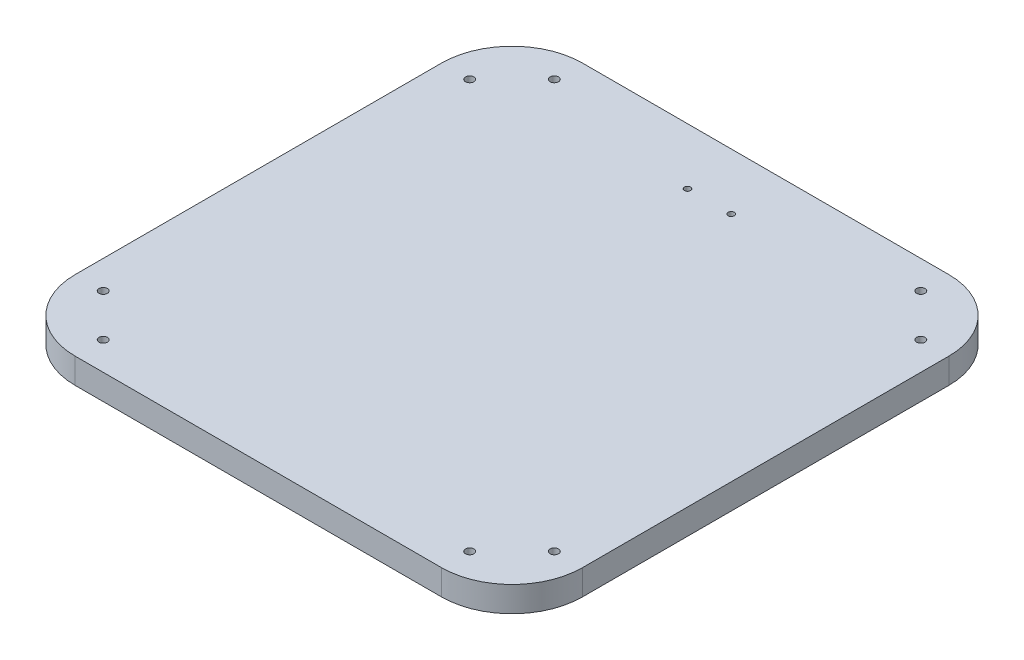
ISO-10303-21;
HEADER;
FILE_DESCRIPTION(('STEP AP214'),'2;1');
FILE_NAME('part.step','',(''),(''),'','','');
FILE_SCHEMA(('AUTOMOTIVE_DESIGN { 1 0 10303 214 1 1 1 1 }'));
ENDSEC;
DATA;
#1=APPLICATION_CONTEXT('core data for automotive mechanical design processes');
#2=APPLICATION_PROTOCOL_DEFINITION('international standard','automotive_design',2000,#1);
#3=PRODUCT_CONTEXT('',#1,'mechanical');
#4=PRODUCT('Part','Part','',(#3));
#5=PRODUCT_RELATED_PRODUCT_CATEGORY('part','',(#4));
#6=PRODUCT_DEFINITION_FORMATION('','',#4);
#7=PRODUCT_DEFINITION_CONTEXT('part definition',#1,'design');
#8=PRODUCT_DEFINITION('design','',#6,#7);
#9=PRODUCT_DEFINITION_SHAPE('','',#8);
#10=(LENGTH_UNIT() NAMED_UNIT(*) SI_UNIT(.MILLI.,.METRE.));
#11=(NAMED_UNIT(*) PLANE_ANGLE_UNIT() SI_UNIT($,.RADIAN.));
#12=(NAMED_UNIT(*) SI_UNIT($,.STERADIAN.) SOLID_ANGLE_UNIT());
#13=UNCERTAINTY_MEASURE_WITH_UNIT(LENGTH_MEASURE(1.E-05),#10,'distance_accuracy_value','');
#14=(GEOMETRIC_REPRESENTATION_CONTEXT(3) GLOBAL_UNCERTAINTY_ASSIGNED_CONTEXT((#13)) GLOBAL_UNIT_ASSIGNED_CONTEXT((#10,
#11,#12)) REPRESENTATION_CONTEXT('',''));
#15=CARTESIAN_POINT('',(0.,0.,0.));
#16=DIRECTION('',(0.,0.,1.));
#17=DIRECTION('',(1.,0.,0.));
#18=AXIS2_PLACEMENT_3D('',#15,#16,#17);
#19=CARTESIAN_POINT('',(64.9999999999998,9.,-64.9999999999999));
#20=DIRECTION('',(0.,-1.,0.));
#21=DIRECTION('',(0.,0.,-1.));
#22=AXIS2_PLACEMENT_3D('',#19,#20,#21);
#23=CYLINDRICAL_SURFACE('',#22,25.0000000000002);
#24=CARTESIAN_POINT('',(64.9999999999998,0.,-64.9999999999999));
#25=DIRECTION('',(0.,1.,0.));
#26=DIRECTION('',(0.,0.,-1.));
#27=AXIS2_PLACEMENT_3D('',#24,#25,#26);
#28=CIRCLE('',#27,25.0000000000002);
#29=CARTESIAN_POINT('',(90.,0.,-64.9999999999999));
#30=VERTEX_POINT('',#29);
#31=CARTESIAN_POINT('',(64.9999999999998,0.,-90.0000000000001));
#32=VERTEX_POINT('',#31);
#33=EDGE_CURVE('E135',#30,#32,#28,.T.);
#34=ORIENTED_EDGE('',*,*,#33,.T.);
#35=DIRECTION('',(0.,-1.,0.));
#36=VECTOR('',#35,1.);
#37=CARTESIAN_POINT('',(64.9999999999998,9.,-90.0000000000001));
#38=LINE('',#37,#36);
#39=CARTESIAN_POINT('',(64.9999999999998,9.,-90.0000000000001));
#40=VERTEX_POINT('',#39);
#41=EDGE_CURVE('E11',#40,#32,#38,.T.);
#42=ORIENTED_EDGE('',*,*,#41,.F.);
#43=CARTESIAN_POINT('',(64.9999999999998,9.,-64.9999999999999));
#44=DIRECTION('',(0.,1.,0.));
#45=DIRECTION('',(0.,0.,-1.));
#46=AXIS2_PLACEMENT_3D('',#43,#44,#45);
#47=CIRCLE('',#46,25.0000000000002);
#48=CARTESIAN_POINT('',(90.,9.,-64.9999999999999));
#49=VERTEX_POINT('',#48);
#50=EDGE_CURVE('E150',#49,#40,#47,.T.);
#51=ORIENTED_EDGE('',*,*,#50,.F.);
#52=DIRECTION('',(0.,-1.,0.));
#53=VECTOR('',#52,1.);
#54=CARTESIAN_POINT('',(90.,9.,-64.9999999999999));
#55=LINE('',#54,#53);
#56=EDGE_CURVE('E131',#49,#30,#55,.T.);
#57=ORIENTED_EDGE('',*,*,#56,.T.);
#58=EDGE_LOOP('',(#34,#42,#51,#57));
#59=FACE_BOUND('',#58,.T.);
#60=ADVANCED_FACE('F39',(#59),#23,.T.);
#61=CARTESIAN_POINT('',(-64.9999999999998,9.,-90.0000000000001));
#62=DIRECTION('',(0.,0.,1.));
#63=DIRECTION('',(1.,0.,0.));
#64=AXIS2_PLACEMENT_3D('',#61,#62,#63);
#65=PLANE('',#64);
#66=DIRECTION('',(-1.,0.,0.));
#67=VECTOR('',#66,1.);
#68=CARTESIAN_POINT('',(-64.9999999999998,0.,-90.0000000000001));
#69=LINE('',#68,#67);
#70=CARTESIAN_POINT('',(-64.9999999999998,0.,-90.0000000000001));
#71=VERTEX_POINT('',#70);
#72=EDGE_CURVE('E138',#32,#71,#69,.T.);
#73=ORIENTED_EDGE('',*,*,#72,.T.);
#74=DIRECTION('',(0.,-1.,0.));
#75=VECTOR('',#74,1.);
#76=CARTESIAN_POINT('',(-64.9999999999998,9.,-90.0000000000001));
#77=LINE('',#76,#75);
#78=CARTESIAN_POINT('',(-64.9999999999998,9.,-90.0000000000001));
#79=VERTEX_POINT('',#78);
#80=EDGE_CURVE('E47',#79,#71,#77,.T.);
#81=ORIENTED_EDGE('',*,*,#80,.F.);
#82=DIRECTION('',(-1.,0.,0.));
#83=VECTOR('',#82,1.);
#84=CARTESIAN_POINT('',(-64.9999999999998,9.,-90.0000000000001));
#85=LINE('',#84,#83);
#86=EDGE_CURVE('E98',#40,#79,#85,.T.);
#87=ORIENTED_EDGE('',*,*,#86,.F.);
#88=ORIENTED_EDGE('',*,*,#41,.T.);
#89=EDGE_LOOP('',(#73,#81,#87,#88));
#90=FACE_BOUND('',#89,.T.);
#91=ADVANCED_FACE('F277',(#90),#65,.F.);
#92=CARTESIAN_POINT('',(-64.9999999999998,9.,-64.9999999999999));
#93=DIRECTION('',(0.,-1.,0.));
#94=DIRECTION('',(0.,0.,-1.));
#95=AXIS2_PLACEMENT_3D('',#92,#93,#94);
#96=CYLINDRICAL_SURFACE('',#95,25.0000000000002);
#97=CARTESIAN_POINT('',(-64.9999999999998,0.,-64.9999999999999));
#98=DIRECTION('',(0.,1.,0.));
#99=DIRECTION('',(0.,0.,-1.));
#100=AXIS2_PLACEMENT_3D('',#97,#98,#99);
#101=CIRCLE('',#100,25.0000000000002);
#102=CARTESIAN_POINT('',(-90.,0.,-64.9999999999999));
#103=VERTEX_POINT('',#102);
#104=EDGE_CURVE('E141',#71,#103,#101,.T.);
#105=ORIENTED_EDGE('',*,*,#104,.T.);
#106=DIRECTION('',(0.,-1.,0.));
#107=VECTOR('',#106,1.);
#108=CARTESIAN_POINT('',(-90.,9.,-64.9999999999999));
#109=LINE('',#108,#107);
#110=CARTESIAN_POINT('',(-90.,9.,-64.9999999999999));
#111=VERTEX_POINT('',#110);
#112=EDGE_CURVE('E157',#111,#103,#109,.T.);
#113=ORIENTED_EDGE('',*,*,#112,.F.);
#114=CARTESIAN_POINT('',(-64.9999999999998,9.,-64.9999999999999));
#115=DIRECTION('',(0.,1.,0.));
#116=DIRECTION('',(0.,0.,-1.));
#117=AXIS2_PLACEMENT_3D('',#114,#115,#116);
#118=CIRCLE('',#117,25.0000000000002);
#119=EDGE_CURVE('E165',#79,#111,#118,.T.);
#120=ORIENTED_EDGE('',*,*,#119,.F.);
#121=ORIENTED_EDGE('',*,*,#80,.T.);
#122=EDGE_LOOP('',(#105,#113,#120,#121));
#123=FACE_BOUND('',#122,.T.);
#124=ADVANCED_FACE('F163',(#123),#96,.T.);
#125=CARTESIAN_POINT('',(-90.,9.,65.));
#126=DIRECTION('',(1.,0.,0.));
#127=DIRECTION('',(0.,0.,-1.));
#128=AXIS2_PLACEMENT_3D('',#125,#126,#127);
#129=PLANE('',#128);
#130=DIRECTION('',(0.,0.,1.));
#131=VECTOR('',#130,1.);
#132=CARTESIAN_POINT('',(-90.,0.,65.));
#133=LINE('',#132,#131);
#134=CARTESIAN_POINT('',(-90.,0.,65.));
#135=VERTEX_POINT('',#134);
#136=EDGE_CURVE('E143',#103,#135,#133,.T.);
#137=ORIENTED_EDGE('',*,*,#136,.T.);
#138=DIRECTION('',(0.,-1.,0.));
#139=VECTOR('',#138,1.);
#140=CARTESIAN_POINT('',(-90.,9.,65.));
#141=LINE('',#140,#139);
#142=CARTESIAN_POINT('',(-90.,9.,65.));
#143=VERTEX_POINT('',#142);
#144=EDGE_CURVE('E154',#143,#135,#141,.T.);
#145=ORIENTED_EDGE('',*,*,#144,.F.);
#146=DIRECTION('',(0.,0.,1.));
#147=VECTOR('',#146,1.);
#148=CARTESIAN_POINT('',(-90.,9.,65.));
#149=LINE('',#148,#147);
#150=EDGE_CURVE('E177',#111,#143,#149,.T.);
#151=ORIENTED_EDGE('',*,*,#150,.F.);
#152=ORIENTED_EDGE('',*,*,#112,.T.);
#153=EDGE_LOOP('',(#137,#145,#151,#152));
#154=FACE_BOUND('',#153,.T.);
#155=ADVANCED_FACE('F173',(#154),#129,.F.);
#156=CARTESIAN_POINT('',(-65.,9.,65.));
#157=DIRECTION('',(0.,-1.,0.));
#158=DIRECTION('',(0.,0.,-1.));
#159=AXIS2_PLACEMENT_3D('',#156,#157,#158);
#160=CYLINDRICAL_SURFACE('',#159,25.);
#161=CARTESIAN_POINT('',(-65.,0.,65.));
#162=DIRECTION('',(0.,1.,0.));
#163=DIRECTION('',(0.,0.,-1.));
#164=AXIS2_PLACEMENT_3D('',#161,#162,#163);
#165=CIRCLE('',#164,25.);
#166=CARTESIAN_POINT('',(-64.9999999999998,0.,90.0000000000001));
#167=VERTEX_POINT('',#166);
#168=EDGE_CURVE('E145',#135,#167,#165,.T.);
#169=ORIENTED_EDGE('',*,*,#168,.T.);
#170=DIRECTION('',(0.,-1.,0.));
#171=VECTOR('',#170,1.);
#172=CARTESIAN_POINT('',(-64.9999999999998,9.,90.0000000000001));
#173=LINE('',#172,#171);
#174=CARTESIAN_POINT('',(-64.9999999999998,9.,90.0000000000001));
#175=VERTEX_POINT('',#174);
#176=EDGE_CURVE('E126',#175,#167,#173,.T.);
#177=ORIENTED_EDGE('',*,*,#176,.F.);
#178=CARTESIAN_POINT('',(-65.,9.,65.));
#179=DIRECTION('',(0.,1.,0.));
#180=DIRECTION('',(0.,0.,-1.));
#181=AXIS2_PLACEMENT_3D('',#178,#179,#180);
#182=CIRCLE('',#181,25.);
#183=EDGE_CURVE('E117',#143,#175,#182,.T.);
#184=ORIENTED_EDGE('',*,*,#183,.F.);
#185=ORIENTED_EDGE('',*,*,#144,.T.);
#186=EDGE_LOOP('',(#169,#177,#184,#185));
#187=FACE_BOUND('',#186,.T.);
#188=ADVANCED_FACE('F176',(#187),#160,.T.);
#189=CARTESIAN_POINT('',(-64.9999999999998,9.,90.0000000000001));
#190=DIRECTION('',(0.,0.,-1.));
#191=DIRECTION('',(-1.,0.,0.));
#192=AXIS2_PLACEMENT_3D('',#189,#190,#191);
#193=PLANE('',#192);
#194=DIRECTION('',(1.,0.,0.));
#195=VECTOR('',#194,1.);
#196=CARTESIAN_POINT('',(-64.9999999999998,0.,90.0000000000001));
#197=LINE('',#196,#195);
#198=CARTESIAN_POINT('',(64.9999999999998,0.,90.0000000000001));
#199=VERTEX_POINT('',#198);
#200=EDGE_CURVE('E125',#167,#199,#197,.T.);
#201=ORIENTED_EDGE('',*,*,#200,.T.);
#202=DIRECTION('',(0.,-1.,0.));
#203=VECTOR('',#202,1.);
#204=CARTESIAN_POINT('',(64.9999999999998,9.,90.0000000000001));
#205=LINE('',#204,#203);
#206=CARTESIAN_POINT('',(64.9999999999998,9.,90.0000000000001));
#207=VERTEX_POINT('',#206);
#208=EDGE_CURVE('E122',#207,#199,#205,.T.);
#209=ORIENTED_EDGE('',*,*,#208,.F.);
#210=DIRECTION('',(1.,0.,0.));
#211=VECTOR('',#210,1.);
#212=CARTESIAN_POINT('',(-64.9999999999998,9.,90.0000000000001));
#213=LINE('',#212,#211);
#214=EDGE_CURVE('E111',#175,#207,#213,.T.);
#215=ORIENTED_EDGE('',*,*,#214,.F.);
#216=ORIENTED_EDGE('',*,*,#176,.T.);
#217=EDGE_LOOP('',(#201,#209,#215,#216));
#218=FACE_BOUND('',#217,.T.);
#219=ADVANCED_FACE('F123',(#218),#193,.F.);
#220=CARTESIAN_POINT('',(65.,9.,65.));
#221=DIRECTION('',(0.,-1.,0.));
#222=DIRECTION('',(0.,0.,-1.));
#223=AXIS2_PLACEMENT_3D('',#220,#221,#222);
#224=CYLINDRICAL_SURFACE('',#223,25.);
#225=CARTESIAN_POINT('',(65.,0.,65.));
#226=DIRECTION('',(0.,1.,0.));
#227=DIRECTION('',(0.,0.,-1.));
#228=AXIS2_PLACEMENT_3D('',#225,#226,#227);
#229=CIRCLE('',#228,25.);
#230=CARTESIAN_POINT('',(90.,0.,65.));
#231=VERTEX_POINT('',#230);
#232=EDGE_CURVE('E84',#199,#231,#229,.T.);
#233=ORIENTED_EDGE('',*,*,#232,.T.);
#234=DIRECTION('',(0.,-1.,0.));
#235=VECTOR('',#234,1.);
#236=CARTESIAN_POINT('',(90.,9.,65.));
#237=LINE('',#236,#235);
#238=CARTESIAN_POINT('',(90.,9.,65.));
#239=VERTEX_POINT('',#238);
#240=EDGE_CURVE('E127',#239,#231,#237,.T.);
#241=ORIENTED_EDGE('',*,*,#240,.F.);
#242=CARTESIAN_POINT('',(65.,9.,65.));
#243=DIRECTION('',(0.,1.,0.));
#244=DIRECTION('',(0.,0.,-1.));
#245=AXIS2_PLACEMENT_3D('',#242,#243,#244);
#246=CIRCLE('',#245,25.);
#247=EDGE_CURVE('E115',#207,#239,#246,.T.);
#248=ORIENTED_EDGE('',*,*,#247,.F.);
#249=ORIENTED_EDGE('',*,*,#208,.T.);
#250=EDGE_LOOP('',(#233,#241,#248,#249));
#251=FACE_BOUND('',#250,.T.);
#252=ADVANCED_FACE('F129',(#251),#224,.T.);
#253=CARTESIAN_POINT('',(90.,9.,65.));
#254=DIRECTION('',(-1.,0.,0.));
#255=DIRECTION('',(0.,0.,1.));
#256=AXIS2_PLACEMENT_3D('',#253,#254,#255);
#257=PLANE('',#256);
#258=DIRECTION('',(0.,0.,-1.));
#259=VECTOR('',#258,1.);
#260=CARTESIAN_POINT('',(90.,0.,65.));
#261=LINE('',#260,#259);
#262=EDGE_CURVE('E90',#231,#30,#261,.T.);
#263=ORIENTED_EDGE('',*,*,#262,.T.);
#264=ORIENTED_EDGE('',*,*,#56,.F.);
#265=DIRECTION('',(0.,0.,-1.));
#266=VECTOR('',#265,1.);
#267=CARTESIAN_POINT('',(90.,9.,65.));
#268=LINE('',#267,#266);
#269=EDGE_CURVE('E55',#239,#49,#268,.T.);
#270=ORIENTED_EDGE('',*,*,#269,.F.);
#271=ORIENTED_EDGE('',*,*,#240,.T.);
#272=EDGE_LOOP('',(#263,#264,#270,#271));
#273=FACE_BOUND('',#272,.T.);
#274=ADVANCED_FACE('F247',(#273),#257,.F.);
#275=CARTESIAN_POINT('',(64.9999999999998,9.,-64.9999999999999));
#276=DIRECTION('',(0.,-1.,0.));
#277=DIRECTION('',(0.,0.,-1.));
#278=AXIS2_PLACEMENT_3D('',#275,#276,#277);
#279=PLANE('',#278);
#280=CARTESIAN_POINT('',(64.9999999999998,9.,-79.9999999999999));
#281=DIRECTION('',(0.,1.,0.));
#282=DIRECTION('',(0.,0.,1.));
#283=AXIS2_PLACEMENT_3D('',#280,#281,#282);
#284=CIRCLE('',#283,1.5);
#285=CARTESIAN_POINT('',(64.9999999999998,9.,-78.4999999999999));
#286=VERTEX_POINT('',#285);
#287=EDGE_CURVE('E216',#286,#286,#284,.T.);
#288=ORIENTED_EDGE('',*,*,#287,.F.);
#289=EDGE_LOOP('',(#288));
#290=FACE_BOUND('',#289,.T.);
#291=CARTESIAN_POINT('',(79.9999999999998,9.,65.));
#292=DIRECTION('',(0.,1.,0.));
#293=DIRECTION('',(0.,0.,1.));
#294=AXIS2_PLACEMENT_3D('',#291,#292,#293);
#295=CIRCLE('',#294,1.5);
#296=CARTESIAN_POINT('',(79.9999999999998,9.,66.5));
#297=VERTEX_POINT('',#296);
#298=EDGE_CURVE('E205',#297,#297,#295,.T.);
#299=ORIENTED_EDGE('',*,*,#298,.F.);
#300=EDGE_LOOP('',(#299));
#301=FACE_BOUND('',#300,.T.);
#302=CARTESIAN_POINT('',(79.9999999999998,9.,-64.9999999999999));
#303=DIRECTION('',(0.,1.,0.));
#304=DIRECTION('',(0.,0.,1.));
#305=AXIS2_PLACEMENT_3D('',#302,#303,#304);
#306=CIRCLE('',#305,1.5);
#307=CARTESIAN_POINT('',(79.9999999999998,9.,-63.4999999999999));
#308=VERTEX_POINT('',#307);
#309=EDGE_CURVE('E204',#308,#308,#306,.T.);
#310=ORIENTED_EDGE('',*,*,#309,.F.);
#311=EDGE_LOOP('',(#310));
#312=FACE_BOUND('',#311,.T.);
#313=CARTESIAN_POINT('',(-79.9999999999998,9.,-64.9999999999999));
#314=DIRECTION('',(0.,1.,0.));
#315=DIRECTION('',(0.,0.,1.));
#316=AXIS2_PLACEMENT_3D('',#313,#314,#315);
#317=CIRCLE('',#316,1.5);
#318=CARTESIAN_POINT('',(-79.9999999999998,9.,-63.4999999999999));
#319=VERTEX_POINT('',#318);
#320=EDGE_CURVE('E198',#319,#319,#317,.T.);
#321=ORIENTED_EDGE('',*,*,#320,.F.);
#322=EDGE_LOOP('',(#321));
#323=FACE_BOUND('',#322,.T.);
#324=CARTESIAN_POINT('',(64.9999999999998,9.,80.));
#325=DIRECTION('',(0.,1.,0.));
#326=DIRECTION('',(0.,0.,1.));
#327=AXIS2_PLACEMENT_3D('',#324,#325,#326);
#328=CIRCLE('',#327,1.5);
#329=CARTESIAN_POINT('',(64.9999999999998,9.,81.5));
#330=VERTEX_POINT('',#329);
#331=EDGE_CURVE('E217',#330,#330,#328,.T.);
#332=ORIENTED_EDGE('',*,*,#331,.F.);
#333=EDGE_LOOP('',(#332));
#334=FACE_BOUND('',#333,.T.);
#335=CARTESIAN_POINT('',(-64.9999999999997,9.,80.));
#336=DIRECTION('',(0.,1.,0.));
#337=DIRECTION('',(0.,0.,1.));
#338=AXIS2_PLACEMENT_3D('',#335,#336,#337);
#339=CIRCLE('',#338,1.5);
#340=CARTESIAN_POINT('',(-64.9999999999997,9.,81.5));
#341=VERTEX_POINT('',#340);
#342=EDGE_CURVE('E234',#341,#341,#339,.T.);
#343=ORIENTED_EDGE('',*,*,#342,.F.);
#344=EDGE_LOOP('',(#343));
#345=FACE_BOUND('',#344,.T.);
#346=CARTESIAN_POINT('',(-79.9999999999997,9.,65.));
#347=DIRECTION('',(0.,1.,0.));
#348=DIRECTION('',(0.,0.,1.));
#349=AXIS2_PLACEMENT_3D('',#346,#347,#348);
#350=CIRCLE('',#349,1.5);
#351=CARTESIAN_POINT('',(-79.9999999999997,9.,66.5));
#352=VERTEX_POINT('',#351);
#353=EDGE_CURVE('E228',#352,#352,#350,.T.);
#354=ORIENTED_EDGE('',*,*,#353,.F.);
#355=EDGE_LOOP('',(#354));
#356=FACE_BOUND('',#355,.T.);
#357=CARTESIAN_POINT('',(-64.9999999999998,9.,-79.9999999999999));
#358=DIRECTION('',(0.,1.,0.));
#359=DIRECTION('',(0.,0.,1.));
#360=AXIS2_PLACEMENT_3D('',#357,#358,#359);
#361=CIRCLE('',#360,1.5);
#362=CARTESIAN_POINT('',(-64.9999999999998,9.,-78.4999999999999));
#363=VERTEX_POINT('',#362);
#364=EDGE_CURVE('E195',#363,#363,#361,.T.);
#365=ORIENTED_EDGE('',*,*,#364,.F.);
#366=EDGE_LOOP('',(#365));
#367=FACE_BOUND('',#366,.T.);
#368=CARTESIAN_POINT('',(-7.747,9.,-70.0000000000001));
#369=DIRECTION('',(0.,1.,0.));
#370=DIRECTION('',(0.,0.,1.));
#371=AXIS2_PLACEMENT_3D('',#368,#369,#370);
#372=CIRCLE('',#371,1.09);
#373=CARTESIAN_POINT('',(-7.747,9.,-68.9100000000001));
#374=VERTEX_POINT('',#373);
#375=EDGE_CURVE('E190',#374,#374,#372,.T.);
#376=ORIENTED_EDGE('',*,*,#375,.F.);
#377=EDGE_LOOP('',(#376));
#378=FACE_BOUND('',#377,.T.);
#379=CARTESIAN_POINT('',(7.747,9.,-70.0000000000001));
#380=DIRECTION('',(0.,1.,0.));
#381=DIRECTION('',(0.,0.,1.));
#382=AXIS2_PLACEMENT_3D('',#379,#380,#381);
#383=CIRCLE('',#382,1.09);
#384=CARTESIAN_POINT('',(7.747,9.,-68.9100000000001));
#385=VERTEX_POINT('',#384);
#386=EDGE_CURVE('E186',#385,#385,#383,.T.);
#387=ORIENTED_EDGE('',*,*,#386,.F.);
#388=EDGE_LOOP('',(#387));
#389=FACE_BOUND('',#388,.T.);
#390=ORIENTED_EDGE('',*,*,#50,.T.);
#391=ORIENTED_EDGE('',*,*,#86,.T.);
#392=ORIENTED_EDGE('',*,*,#119,.T.);
#393=ORIENTED_EDGE('',*,*,#150,.T.);
#394=ORIENTED_EDGE('',*,*,#183,.T.);
#395=ORIENTED_EDGE('',*,*,#214,.T.);
#396=ORIENTED_EDGE('',*,*,#247,.T.);
#397=ORIENTED_EDGE('',*,*,#269,.T.);
#398=EDGE_LOOP('',(#390,#391,#392,#393,#394,#395,#396,#397));
#399=FACE_BOUND('',#398,.T.);
#400=ADVANCED_FACE('F113',(#290,#301,#312,#323,#334,#345,#356,#367,#378,#389,#399),#279,.F.);
#401=CARTESIAN_POINT('',(64.9999999999998,0.,-64.9999999999999));
#402=DIRECTION('',(0.,-1.,0.));
#403=DIRECTION('',(0.,0.,-1.));
#404=AXIS2_PLACEMENT_3D('',#401,#402,#403);
#405=PLANE('',#404);
#406=CARTESIAN_POINT('',(64.9999999999998,0.,-79.9999999999999));
#407=DIRECTION('',(0.,1.,0.));
#408=DIRECTION('',(0.,0.,1.));
#409=AXIS2_PLACEMENT_3D('',#406,#407,#408);
#410=CIRCLE('',#409,1.5);
#411=CARTESIAN_POINT('',(64.9999999999998,0.,-78.4999999999999));
#412=VERTEX_POINT('',#411);
#413=EDGE_CURVE('E213',#412,#412,#410,.T.);
#414=ORIENTED_EDGE('',*,*,#413,.T.);
#415=EDGE_LOOP('',(#414));
#416=FACE_BOUND('',#415,.T.);
#417=CARTESIAN_POINT('',(79.9999999999998,0.,65.));
#418=DIRECTION('',(0.,1.,0.));
#419=DIRECTION('',(0.,0.,1.));
#420=AXIS2_PLACEMENT_3D('',#417,#418,#419);
#421=CIRCLE('',#420,1.5);
#422=CARTESIAN_POINT('',(79.9999999999998,0.,66.5));
#423=VERTEX_POINT('',#422);
#424=EDGE_CURVE('E220',#423,#423,#421,.T.);
#425=ORIENTED_EDGE('',*,*,#424,.T.);
#426=EDGE_LOOP('',(#425));
#427=FACE_BOUND('',#426,.T.);
#428=CARTESIAN_POINT('',(79.9999999999998,0.,-64.9999999999999));
#429=DIRECTION('',(0.,1.,0.));
#430=DIRECTION('',(0.,0.,1.));
#431=AXIS2_PLACEMENT_3D('',#428,#429,#430);
#432=CIRCLE('',#431,1.5);
#433=CARTESIAN_POINT('',(79.9999999999998,0.,-63.4999999999999));
#434=VERTEX_POINT('',#433);
#435=EDGE_CURVE('E201',#434,#434,#432,.T.);
#436=ORIENTED_EDGE('',*,*,#435,.T.);
#437=EDGE_LOOP('',(#436));
#438=FACE_BOUND('',#437,.T.);
#439=CARTESIAN_POINT('',(-79.9999999999998,0.,-64.9999999999999));
#440=DIRECTION('',(0.,1.,0.));
#441=DIRECTION('',(0.,0.,1.));
#442=AXIS2_PLACEMENT_3D('',#439,#440,#441);
#443=CIRCLE('',#442,1.5);
#444=CARTESIAN_POINT('',(-79.9999999999998,0.,-63.4999999999999));
#445=VERTEX_POINT('',#444);
#446=EDGE_CURVE('E208',#445,#445,#443,.T.);
#447=ORIENTED_EDGE('',*,*,#446,.T.);
#448=EDGE_LOOP('',(#447));
#449=FACE_BOUND('',#448,.T.);
#450=CARTESIAN_POINT('',(64.9999999999998,0.,80.));
#451=DIRECTION('',(0.,1.,0.));
#452=DIRECTION('',(0.,0.,1.));
#453=AXIS2_PLACEMENT_3D('',#450,#451,#452);
#454=CIRCLE('',#453,1.5);
#455=CARTESIAN_POINT('',(64.9999999999998,0.,81.5));
#456=VERTEX_POINT('',#455);
#457=EDGE_CURVE('E237',#456,#456,#454,.T.);
#458=ORIENTED_EDGE('',*,*,#457,.T.);
#459=EDGE_LOOP('',(#458));
#460=FACE_BOUND('',#459,.T.);
#461=CARTESIAN_POINT('',(-64.9999999999997,0.,80.));
#462=DIRECTION('',(0.,1.,0.));
#463=DIRECTION('',(0.,0.,1.));
#464=AXIS2_PLACEMENT_3D('',#461,#462,#463);
#465=CIRCLE('',#464,1.5);
#466=CARTESIAN_POINT('',(-64.9999999999997,0.,81.5));
#467=VERTEX_POINT('',#466);
#468=EDGE_CURVE('E231',#467,#467,#465,.T.);
#469=ORIENTED_EDGE('',*,*,#468,.T.);
#470=EDGE_LOOP('',(#469));
#471=FACE_BOUND('',#470,.T.);
#472=CARTESIAN_POINT('',(-79.9999999999997,0.,65.));
#473=DIRECTION('',(0.,1.,0.));
#474=DIRECTION('',(0.,0.,1.));
#475=AXIS2_PLACEMENT_3D('',#472,#473,#474);
#476=CIRCLE('',#475,1.5);
#477=CARTESIAN_POINT('',(-79.9999999999997,0.,66.5));
#478=VERTEX_POINT('',#477);
#479=EDGE_CURVE('E225',#478,#478,#476,.T.);
#480=ORIENTED_EDGE('',*,*,#479,.T.);
#481=EDGE_LOOP('',(#480));
#482=FACE_BOUND('',#481,.T.);
#483=CARTESIAN_POINT('',(-64.9999999999998,0.,-79.9999999999999));
#484=DIRECTION('',(0.,1.,0.));
#485=DIRECTION('',(0.,0.,1.));
#486=AXIS2_PLACEMENT_3D('',#483,#484,#485);
#487=CIRCLE('',#486,1.5);
#488=CARTESIAN_POINT('',(-64.9999999999998,0.,-78.4999999999999));
#489=VERTEX_POINT('',#488);
#490=EDGE_CURVE('E187',#489,#489,#487,.T.);
#491=ORIENTED_EDGE('',*,*,#490,.T.);
#492=EDGE_LOOP('',(#491));
#493=FACE_BOUND('',#492,.T.);
#494=CARTESIAN_POINT('',(-7.747,0.,-70.0000000000001));
#495=DIRECTION('',(0.,1.,0.));
#496=DIRECTION('',(0.,0.,1.));
#497=AXIS2_PLACEMENT_3D('',#494,#495,#496);
#498=CIRCLE('',#497,1.09);
#499=CARTESIAN_POINT('',(-7.747,0.,-68.9100000000001));
#500=VERTEX_POINT('',#499);
#501=EDGE_CURVE('E139',#500,#500,#498,.T.);
#502=ORIENTED_EDGE('',*,*,#501,.T.);
#503=EDGE_LOOP('',(#502));
#504=FACE_BOUND('',#503,.T.);
#505=CARTESIAN_POINT('',(7.747,0.,-70.0000000000001));
#506=DIRECTION('',(0.,1.,0.));
#507=DIRECTION('',(0.,0.,1.));
#508=AXIS2_PLACEMENT_3D('',#505,#506,#507);
#509=CIRCLE('',#508,1.09);
#510=CARTESIAN_POINT('',(7.747,0.,-68.9100000000001));
#511=VERTEX_POINT('',#510);
#512=EDGE_CURVE('E183',#511,#511,#509,.T.);
#513=ORIENTED_EDGE('',*,*,#512,.T.);
#514=EDGE_LOOP('',(#513));
#515=FACE_BOUND('',#514,.T.);
#516=ORIENTED_EDGE('',*,*,#33,.F.);
#517=ORIENTED_EDGE('',*,*,#262,.F.);
#518=ORIENTED_EDGE('',*,*,#232,.F.);
#519=ORIENTED_EDGE('',*,*,#200,.F.);
#520=ORIENTED_EDGE('',*,*,#168,.F.);
#521=ORIENTED_EDGE('',*,*,#136,.F.);
#522=ORIENTED_EDGE('',*,*,#104,.F.);
#523=ORIENTED_EDGE('',*,*,#72,.F.);
#524=EDGE_LOOP('',(#516,#517,#518,#519,#520,#521,#522,#523));
#525=FACE_BOUND('',#524,.T.);
#526=ADVANCED_FACE('F169',(#416,#427,#438,#449,#460,#471,#482,#493,#504,#515,#525),#405,.T.);
#527=CARTESIAN_POINT('',(7.747,0.,-70.0000000000001));
#528=DIRECTION('',(0.,1.,0.));
#529=DIRECTION('',(0.,0.,1.));
#530=AXIS2_PLACEMENT_3D('',#527,#528,#529);
#531=CYLINDRICAL_SURFACE('',#530,1.09);
#532=ORIENTED_EDGE('',*,*,#512,.F.);
#533=EDGE_LOOP('',(#532));
#534=FACE_BOUND('',#533,.T.);
#535=ORIENTED_EDGE('',*,*,#386,.T.);
#536=EDGE_LOOP('',(#535));
#537=FACE_BOUND('',#536,.T.);
#538=ADVANCED_FACE('F260',(#534,#537),#531,.F.);
#539=CARTESIAN_POINT('',(-7.747,0.,-70.0000000000001));
#540=DIRECTION('',(0.,1.,0.));
#541=DIRECTION('',(0.,0.,1.));
#542=AXIS2_PLACEMENT_3D('',#539,#540,#541);
#543=CYLINDRICAL_SURFACE('',#542,1.09);
#544=ORIENTED_EDGE('',*,*,#501,.F.);
#545=EDGE_LOOP('',(#544));
#546=FACE_BOUND('',#545,.T.);
#547=ORIENTED_EDGE('',*,*,#375,.T.);
#548=EDGE_LOOP('',(#547));
#549=FACE_BOUND('',#548,.T.);
#550=ADVANCED_FACE('F262',(#546,#549),#543,.F.);
#551=CARTESIAN_POINT('',(-64.9999999999998,0.,-79.9999999999999));
#552=DIRECTION('',(0.,1.,0.));
#553=DIRECTION('',(0.,0.,1.));
#554=AXIS2_PLACEMENT_3D('',#551,#552,#553);
#555=CYLINDRICAL_SURFACE('',#554,1.5);
#556=ORIENTED_EDGE('',*,*,#490,.F.);
#557=EDGE_LOOP('',(#556));
#558=FACE_BOUND('',#557,.T.);
#559=ORIENTED_EDGE('',*,*,#364,.T.);
#560=EDGE_LOOP('',(#559));
#561=FACE_BOUND('',#560,.T.);
#562=ADVANCED_FACE('F269',(#558,#561),#555,.F.);
#563=CARTESIAN_POINT('',(-79.9999999999997,0.,65.));
#564=DIRECTION('',(0.,1.,0.));
#565=DIRECTION('',(0.,0.,1.));
#566=AXIS2_PLACEMENT_3D('',#563,#564,#565);
#567=CYLINDRICAL_SURFACE('',#566,1.5);
#568=ORIENTED_EDGE('',*,*,#479,.F.);
#569=EDGE_LOOP('',(#568));
#570=FACE_BOUND('',#569,.T.);
#571=ORIENTED_EDGE('',*,*,#353,.T.);
#572=EDGE_LOOP('',(#571));
#573=FACE_BOUND('',#572,.T.);
#574=ADVANCED_FACE('F357',(#570,#573),#567,.F.);
#575=CARTESIAN_POINT('',(-64.9999999999997,0.,80.));
#576=DIRECTION('',(0.,1.,0.));
#577=DIRECTION('',(0.,0.,1.));
#578=AXIS2_PLACEMENT_3D('',#575,#576,#577);
#579=CYLINDRICAL_SURFACE('',#578,1.5);
#580=ORIENTED_EDGE('',*,*,#468,.F.);
#581=EDGE_LOOP('',(#580));
#582=FACE_BOUND('',#581,.T.);
#583=ORIENTED_EDGE('',*,*,#342,.T.);
#584=EDGE_LOOP('',(#583));
#585=FACE_BOUND('',#584,.T.);
#586=ADVANCED_FACE('F367',(#582,#585),#579,.F.);
#587=CARTESIAN_POINT('',(64.9999999999998,0.,80.));
#588=DIRECTION('',(0.,1.,0.));
#589=DIRECTION('',(0.,0.,1.));
#590=AXIS2_PLACEMENT_3D('',#587,#588,#589);
#591=CYLINDRICAL_SURFACE('',#590,1.5);
#592=ORIENTED_EDGE('',*,*,#457,.F.);
#593=EDGE_LOOP('',(#592));
#594=FACE_BOUND('',#593,.T.);
#595=ORIENTED_EDGE('',*,*,#331,.T.);
#596=EDGE_LOOP('',(#595));
#597=FACE_BOUND('',#596,.T.);
#598=ADVANCED_FACE('F243',(#594,#597),#591,.F.);
#599=CARTESIAN_POINT('',(-79.9999999999998,0.,-64.9999999999999));
#600=DIRECTION('',(0.,1.,0.));
#601=DIRECTION('',(0.,0.,1.));
#602=AXIS2_PLACEMENT_3D('',#599,#600,#601);
#603=CYLINDRICAL_SURFACE('',#602,1.5);
#604=ORIENTED_EDGE('',*,*,#446,.F.);
#605=EDGE_LOOP('',(#604));
#606=FACE_BOUND('',#605,.T.);
#607=ORIENTED_EDGE('',*,*,#320,.T.);
#608=EDGE_LOOP('',(#607));
#609=FACE_BOUND('',#608,.T.);
#610=ADVANCED_FACE('F386',(#606,#609),#603,.F.);
#611=CARTESIAN_POINT('',(79.9999999999998,0.,-64.9999999999999));
#612=DIRECTION('',(0.,1.,0.));
#613=DIRECTION('',(0.,0.,1.));
#614=AXIS2_PLACEMENT_3D('',#611,#612,#613);
#615=CYLINDRICAL_SURFACE('',#614,1.5);
#616=ORIENTED_EDGE('',*,*,#435,.F.);
#617=EDGE_LOOP('',(#616));
#618=FACE_BOUND('',#617,.T.);
#619=ORIENTED_EDGE('',*,*,#309,.T.);
#620=EDGE_LOOP('',(#619));
#621=FACE_BOUND('',#620,.T.);
#622=ADVANCED_FACE('F396',(#618,#621),#615,.F.);
#623=CARTESIAN_POINT('',(79.9999999999998,0.,65.));
#624=DIRECTION('',(0.,1.,0.));
#625=DIRECTION('',(0.,0.,1.));
#626=AXIS2_PLACEMENT_3D('',#623,#624,#625);
#627=CYLINDRICAL_SURFACE('',#626,1.5);
#628=ORIENTED_EDGE('',*,*,#424,.F.);
#629=EDGE_LOOP('',(#628));
#630=FACE_BOUND('',#629,.T.);
#631=ORIENTED_EDGE('',*,*,#298,.T.);
#632=EDGE_LOOP('',(#631));
#633=FACE_BOUND('',#632,.T.);
#634=ADVANCED_FACE('F406',(#630,#633),#627,.F.);
#635=CARTESIAN_POINT('',(64.9999999999998,0.,-79.9999999999999));
#636=DIRECTION('',(0.,1.,0.));
#637=DIRECTION('',(0.,0.,1.));
#638=AXIS2_PLACEMENT_3D('',#635,#636,#637);
#639=CYLINDRICAL_SURFACE('',#638,1.5);
#640=ORIENTED_EDGE('',*,*,#413,.F.);
#641=EDGE_LOOP('',(#640));
#642=FACE_BOUND('',#641,.T.);
#643=ORIENTED_EDGE('',*,*,#287,.T.);
#644=EDGE_LOOP('',(#643));
#645=FACE_BOUND('',#644,.T.);
#646=ADVANCED_FACE('F416',(#642,#645),#639,.F.);
#647=CLOSED_SHELL('',(#60,#91,#124,#155,#188,#219,#252,#274,#400,#526,#538,#550,#562,#574,#586,
#598,#610,#622,#634,#646));
#648=MANIFOLD_SOLID_BREP('B2',#647);
#649=ADVANCED_BREP_SHAPE_REPRESENTATION('',(#18,#648),#14);
#650=SHAPE_DEFINITION_REPRESENTATION(#9,#649);
ENDSEC;
END-ISO-10303-21;
